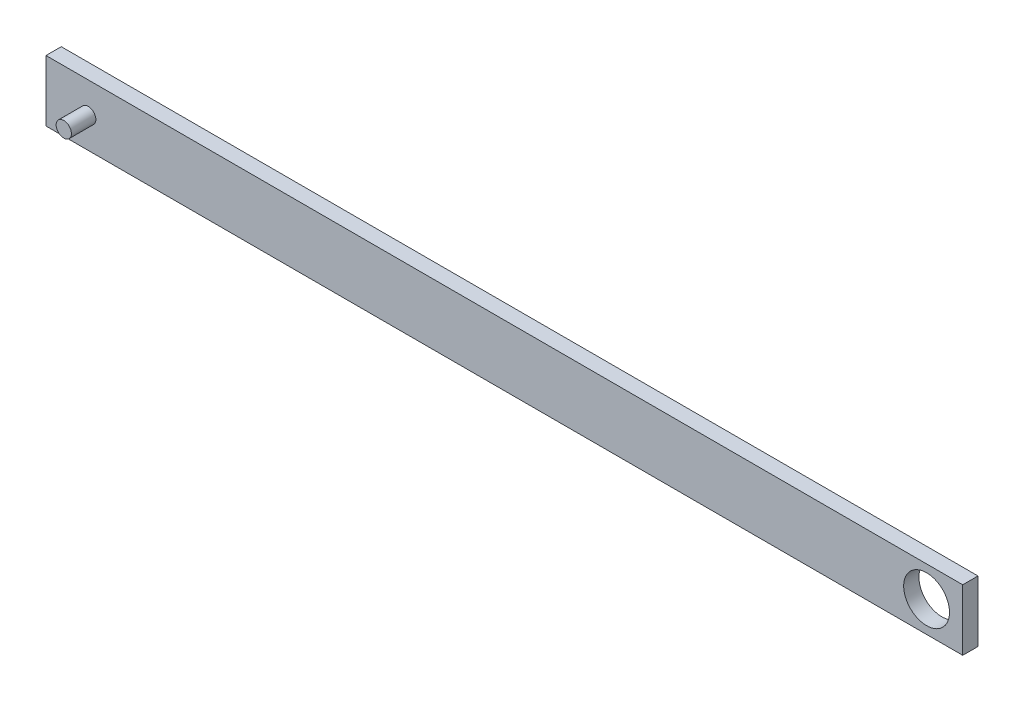
ISO-10303-21;
HEADER;
FILE_DESCRIPTION(('STEP AP214'),'2;1');
FILE_NAME('part.step','',(''),(''),'','','');
FILE_SCHEMA(('AUTOMOTIVE_DESIGN { 1 0 10303 214 1 1 1 1 }'));
ENDSEC;
DATA;
#1=APPLICATION_CONTEXT('core data for automotive mechanical design processes');
#2=APPLICATION_PROTOCOL_DEFINITION('international standard','automotive_design',2000,#1);
#3=PRODUCT_CONTEXT('',#1,'mechanical');
#4=PRODUCT('Part','Part','',(#3));
#5=PRODUCT_RELATED_PRODUCT_CATEGORY('part','',(#4));
#6=PRODUCT_DEFINITION_FORMATION('','',#4);
#7=PRODUCT_DEFINITION_CONTEXT('part definition',#1,'design');
#8=PRODUCT_DEFINITION('design','',#6,#7);
#9=PRODUCT_DEFINITION_SHAPE('','',#8);
#10=(LENGTH_UNIT() NAMED_UNIT(*) SI_UNIT(.MILLI.,.METRE.));
#11=(NAMED_UNIT(*) PLANE_ANGLE_UNIT() SI_UNIT($,.RADIAN.));
#12=(NAMED_UNIT(*) SI_UNIT($,.STERADIAN.) SOLID_ANGLE_UNIT());
#13=UNCERTAINTY_MEASURE_WITH_UNIT(LENGTH_MEASURE(1.E-05),#10,'distance_accuracy_value','');
#14=(GEOMETRIC_REPRESENTATION_CONTEXT(3) GLOBAL_UNCERTAINTY_ASSIGNED_CONTEXT((#13)) GLOBAL_UNIT_ASSIGNED_CONTEXT((#10,
#11,#12)) REPRESENTATION_CONTEXT('',''));
#15=CARTESIAN_POINT('',(0.,0.,0.));
#16=DIRECTION('',(0.,0.,1.));
#17=DIRECTION('',(1.,0.,0.));
#18=AXIS2_PLACEMENT_3D('',#15,#16,#17);
#19=CARTESIAN_POINT('',(-150.,-10.,5.));
#20=DIRECTION('',(1.,0.,0.));
#21=DIRECTION('',(0.,0.,-1.));
#22=AXIS2_PLACEMENT_3D('',#19,#20,#21);
#23=PLANE('',#22);
#24=DIRECTION('',(0.,-1.,0.));
#25=VECTOR('',#24,1.);
#26=CARTESIAN_POINT('',(-150.,-10.,0.));
#27=LINE('',#26,#25);
#28=CARTESIAN_POINT('',(-150.,9.99999999999998,0.));
#29=VERTEX_POINT('',#28);
#30=CARTESIAN_POINT('',(-150.,-10.,0.));
#31=VERTEX_POINT('',#30);
#32=EDGE_CURVE('E95',#29,#31,#27,.T.);
#33=ORIENTED_EDGE('',*,*,#32,.T.);
#34=DIRECTION('',(0.,0.,-1.));
#35=VECTOR('',#34,1.);
#36=CARTESIAN_POINT('',(-150.,-10.,5.));
#37=LINE('',#36,#35);
#38=CARTESIAN_POINT('',(-150.,-10.,5.));
#39=VERTEX_POINT('',#38);
#40=EDGE_CURVE('E11',#39,#31,#37,.T.);
#41=ORIENTED_EDGE('',*,*,#40,.F.);
#42=DIRECTION('',(0.,-1.,0.));
#43=VECTOR('',#42,1.);
#44=CARTESIAN_POINT('',(-150.,-10.,5.));
#45=LINE('',#44,#43);
#46=CARTESIAN_POINT('',(-150.,9.99999999999998,5.));
#47=VERTEX_POINT('',#46);
#48=EDGE_CURVE('E83',#47,#39,#45,.T.);
#49=ORIENTED_EDGE('',*,*,#48,.F.);
#50=DIRECTION('',(0.,0.,-1.));
#51=VECTOR('',#50,1.);
#52=CARTESIAN_POINT('',(-150.,9.99999999999998,5.));
#53=LINE('',#52,#51);
#54=EDGE_CURVE('E91',#47,#29,#53,.T.);
#55=ORIENTED_EDGE('',*,*,#54,.T.);
#56=EDGE_LOOP('',(#33,#41,#49,#55));
#57=FACE_BOUND('',#56,.T.);
#58=ADVANCED_FACE('F32',(#57),#23,.F.);
#59=CARTESIAN_POINT('',(150.,-9.99999999999998,5.));
#60=DIRECTION('',(0.,1.,0.));
#61=DIRECTION('',(-1.,0.,0.));
#62=AXIS2_PLACEMENT_3D('',#59,#60,#61);
#63=PLANE('',#62);
#64=DIRECTION('',(1.,0.,0.));
#65=VECTOR('',#64,1.);
#66=CARTESIAN_POINT('',(150.,-9.99999999999998,0.));
#67=LINE('',#66,#65);
#68=CARTESIAN_POINT('',(150.,-9.99999999999998,0.));
#69=VERTEX_POINT('',#68);
#70=EDGE_CURVE('E87',#31,#69,#67,.T.);
#71=ORIENTED_EDGE('',*,*,#70,.T.);
#72=DIRECTION('',(0.,0.,-1.));
#73=VECTOR('',#72,1.);
#74=CARTESIAN_POINT('',(150.,-9.99999999999998,5.));
#75=LINE('',#74,#73);
#76=CARTESIAN_POINT('',(150.,-9.99999999999998,5.));
#77=VERTEX_POINT('',#76);
#78=EDGE_CURVE('E40',#77,#69,#75,.T.);
#79=ORIENTED_EDGE('',*,*,#78,.F.);
#80=DIRECTION('',(1.,0.,0.));
#81=VECTOR('',#80,1.);
#82=CARTESIAN_POINT('',(150.,-9.99999999999998,5.));
#83=LINE('',#82,#81);
#84=EDGE_CURVE('E78',#39,#77,#83,.T.);
#85=ORIENTED_EDGE('',*,*,#84,.F.);
#86=ORIENTED_EDGE('',*,*,#40,.T.);
#87=EDGE_LOOP('',(#71,#79,#85,#86));
#88=FACE_BOUND('',#87,.T.);
#89=ADVANCED_FACE('F86',(#88),#63,.F.);
#90=CARTESIAN_POINT('',(150.,-9.99999999999998,5.));
#91=DIRECTION('',(-1.,0.,0.));
#92=DIRECTION('',(0.,0.,1.));
#93=AXIS2_PLACEMENT_3D('',#90,#91,#92);
#94=PLANE('',#93);
#95=DIRECTION('',(0.,1.,0.));
#96=VECTOR('',#95,1.);
#97=CARTESIAN_POINT('',(150.,-9.99999999999998,0.));
#98=LINE('',#97,#96);
#99=CARTESIAN_POINT('',(150.,10.,0.));
#100=VERTEX_POINT('',#99);
#101=EDGE_CURVE('E65',#69,#100,#98,.T.);
#102=ORIENTED_EDGE('',*,*,#101,.T.);
#103=DIRECTION('',(0.,0.,-1.));
#104=VECTOR('',#103,1.);
#105=CARTESIAN_POINT('',(150.,10.,5.));
#106=LINE('',#105,#104);
#107=CARTESIAN_POINT('',(150.,10.,5.));
#108=VERTEX_POINT('',#107);
#109=EDGE_CURVE('E88',#108,#100,#106,.T.);
#110=ORIENTED_EDGE('',*,*,#109,.F.);
#111=DIRECTION('',(0.,1.,0.));
#112=VECTOR('',#111,1.);
#113=CARTESIAN_POINT('',(150.,-9.99999999999998,5.));
#114=LINE('',#113,#112);
#115=EDGE_CURVE('E81',#77,#108,#114,.T.);
#116=ORIENTED_EDGE('',*,*,#115,.F.);
#117=ORIENTED_EDGE('',*,*,#78,.T.);
#118=EDGE_LOOP('',(#102,#110,#116,#117));
#119=FACE_BOUND('',#118,.T.);
#120=ADVANCED_FACE('F89',(#119),#94,.F.);
#121=CARTESIAN_POINT('',(150.,10.,5.));
#122=DIRECTION('',(0.,-1.,0.));
#123=DIRECTION('',(1.,0.,0.));
#124=AXIS2_PLACEMENT_3D('',#121,#122,#123);
#125=PLANE('',#124);
#126=DIRECTION('',(-1.,0.,0.));
#127=VECTOR('',#126,1.);
#128=CARTESIAN_POINT('',(150.,10.,0.));
#129=LINE('',#128,#127);
#130=EDGE_CURVE('E71',#100,#29,#129,.T.);
#131=ORIENTED_EDGE('',*,*,#130,.T.);
#132=ORIENTED_EDGE('',*,*,#54,.F.);
#133=DIRECTION('',(-1.,0.,0.));
#134=VECTOR('',#133,1.);
#135=CARTESIAN_POINT('',(150.,10.,5.));
#136=LINE('',#135,#134);
#137=EDGE_CURVE('E48',#108,#47,#136,.T.);
#138=ORIENTED_EDGE('',*,*,#137,.F.);
#139=ORIENTED_EDGE('',*,*,#109,.T.);
#140=EDGE_LOOP('',(#131,#132,#138,#139));
#141=FACE_BOUND('',#140,.T.);
#142=ADVANCED_FACE('F103',(#141),#125,.F.);
#143=CARTESIAN_POINT('',(0.,0.,5.));
#144=DIRECTION('',(0.,0.,1.));
#145=DIRECTION('',(1.,0.,0.));
#146=AXIS2_PLACEMENT_3D('',#143,#144,#145);
#147=PLANE('',#146);
#148=CARTESIAN_POINT('',(-136.185092232572,0.,5.));
#149=DIRECTION('',(0.,0.,1.));
#150=DIRECTION('',(1.,0.,0.));
#151=AXIS2_PLACEMENT_3D('',#148,#149,#150);
#152=CIRCLE('',#151,2.5);
#153=CARTESIAN_POINT('',(-133.685092232572,0.,5.));
#154=VERTEX_POINT('',#153);
#155=EDGE_CURVE('E115',#154,#154,#152,.T.);
#156=ORIENTED_EDGE('',*,*,#155,.F.);
#157=EDGE_LOOP('',(#156));
#158=FACE_BOUND('',#157,.T.);
#159=CARTESIAN_POINT('',(138.172978114404,0.,5.));
#160=DIRECTION('',(0.,0.,1.));
#161=DIRECTION('',(1.,0.,0.));
#162=AXIS2_PLACEMENT_3D('',#159,#160,#161);
#163=CIRCLE('',#162,7.50000000000001);
#164=CARTESIAN_POINT('',(145.672978114404,0.,5.));
#165=VERTEX_POINT('',#164);
#166=EDGE_CURVE('E109',#165,#165,#163,.T.);
#167=ORIENTED_EDGE('',*,*,#166,.F.);
#168=EDGE_LOOP('',(#167));
#169=FACE_BOUND('',#168,.T.);
#170=ORIENTED_EDGE('',*,*,#48,.T.);
#171=ORIENTED_EDGE('',*,*,#84,.T.);
#172=ORIENTED_EDGE('',*,*,#115,.T.);
#173=ORIENTED_EDGE('',*,*,#137,.T.);
#174=EDGE_LOOP('',(#170,#171,#172,#173));
#175=FACE_BOUND('',#174,.T.);
#176=ADVANCED_FACE('F79',(#158,#169,#175),#147,.T.);
#177=CARTESIAN_POINT('',(0.,0.,0.));
#178=DIRECTION('',(0.,0.,1.));
#179=DIRECTION('',(1.,0.,0.));
#180=AXIS2_PLACEMENT_3D('',#177,#178,#179);
#181=PLANE('',#180);
#182=CARTESIAN_POINT('',(138.172978114404,0.,0.));
#183=DIRECTION('',(0.,0.,1.));
#184=DIRECTION('',(1.,0.,0.));
#185=AXIS2_PLACEMENT_3D('',#182,#183,#184);
#186=CIRCLE('',#185,7.50000000000001);
#187=CARTESIAN_POINT('',(145.672978114404,0.,0.));
#188=VERTEX_POINT('',#187);
#189=EDGE_CURVE('E98',#188,#188,#186,.T.);
#190=ORIENTED_EDGE('',*,*,#189,.T.);
#191=EDGE_LOOP('',(#190));
#192=FACE_BOUND('',#191,.T.);
#193=ORIENTED_EDGE('',*,*,#32,.F.);
#194=ORIENTED_EDGE('',*,*,#130,.F.);
#195=ORIENTED_EDGE('',*,*,#101,.F.);
#196=ORIENTED_EDGE('',*,*,#70,.F.);
#197=EDGE_LOOP('',(#193,#194,#195,#196));
#198=FACE_BOUND('',#197,.T.);
#199=ADVANCED_FACE('F106',(#192,#198),#181,.F.);
#200=CARTESIAN_POINT('',(138.172978114404,0.,0.));
#201=DIRECTION('',(0.,0.,1.));
#202=DIRECTION('',(1.,0.,0.));
#203=AXIS2_PLACEMENT_3D('',#200,#201,#202);
#204=CYLINDRICAL_SURFACE('',#203,7.50000000000001);
#205=ORIENTED_EDGE('',*,*,#189,.F.);
#206=EDGE_LOOP('',(#205));
#207=FACE_BOUND('',#206,.T.);
#208=ORIENTED_EDGE('',*,*,#166,.T.);
#209=EDGE_LOOP('',(#208));
#210=FACE_BOUND('',#209,.T.);
#211=ADVANCED_FACE('F126',(#207,#210),#204,.F.);
#212=CARTESIAN_POINT('',(-136.185092232572,0.,13.));
#213=DIRECTION('',(0.,0.,-1.));
#214=DIRECTION('',(-1.,0.,0.));
#215=AXIS2_PLACEMENT_3D('',#212,#213,#214);
#216=CYLINDRICAL_SURFACE('',#215,2.5);
#217=CARTESIAN_POINT('',(-136.185092232572,0.,13.));
#218=DIRECTION('',(0.,0.,1.));
#219=DIRECTION('',(1.,0.,0.));
#220=AXIS2_PLACEMENT_3D('',#217,#218,#219);
#221=CIRCLE('',#220,2.5);
#222=CARTESIAN_POINT('',(-133.685092232572,0.,13.));
#223=VERTEX_POINT('',#222);
#224=EDGE_CURVE('E112',#223,#223,#221,.T.);
#225=ORIENTED_EDGE('',*,*,#224,.F.);
#226=EDGE_LOOP('',(#225));
#227=FACE_BOUND('',#226,.T.);
#228=ORIENTED_EDGE('',*,*,#155,.T.);
#229=EDGE_LOOP('',(#228));
#230=FACE_BOUND('',#229,.T.);
#231=ADVANCED_FACE('F123',(#227,#230),#216,.T.);
#232=CARTESIAN_POINT('',(-136.185092232572,0.,13.));
#233=DIRECTION('',(0.,0.,1.));
#234=DIRECTION('',(1.,0.,0.));
#235=AXIS2_PLACEMENT_3D('',#232,#233,#234);
#236=PLANE('',#235);
#237=ORIENTED_EDGE('',*,*,#224,.T.);
#238=EDGE_LOOP('',(#237));
#239=FACE_BOUND('',#238,.T.);
#240=ADVANCED_FACE('F121',(#239),#236,.T.);
#241=CLOSED_SHELL('',(#58,#89,#120,#142,#176,#199,#211,#231,#240));
#242=MANIFOLD_SOLID_BREP('B2',#241);
#243=ADVANCED_BREP_SHAPE_REPRESENTATION('',(#18,#242),#14);
#244=SHAPE_DEFINITION_REPRESENTATION(#9,#243);
ENDSEC;
END-ISO-10303-21;
